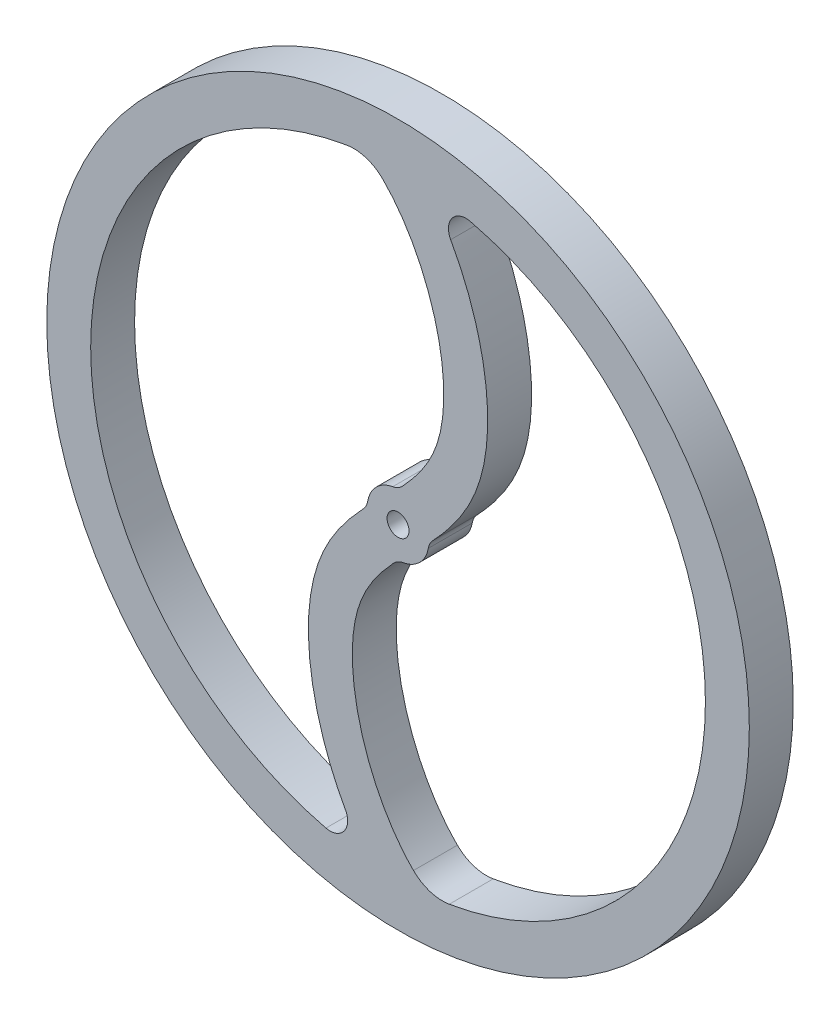
ISO-10303-21;
HEADER;
FILE_DESCRIPTION(('STEP AP214'),'2;1');
FILE_NAME('part.step','',(''),(''),'','','');
FILE_SCHEMA(('AUTOMOTIVE_DESIGN { 1 0 10303 214 1 1 1 1 }'));
ENDSEC;
DATA;
#1=APPLICATION_CONTEXT('core data for automotive mechanical design processes');
#2=APPLICATION_PROTOCOL_DEFINITION('international standard','automotive_design',2000,#1);
#3=PRODUCT_CONTEXT('',#1,'mechanical');
#4=PRODUCT('Part','Part','',(#3));
#5=PRODUCT_RELATED_PRODUCT_CATEGORY('part','',(#4));
#6=PRODUCT_DEFINITION_FORMATION('','',#4);
#7=PRODUCT_DEFINITION_CONTEXT('part definition',#1,'design');
#8=PRODUCT_DEFINITION('design','',#6,#7);
#9=PRODUCT_DEFINITION_SHAPE('','',#8);
#10=(LENGTH_UNIT() NAMED_UNIT(*) SI_UNIT(.MILLI.,.METRE.));
#11=(NAMED_UNIT(*) PLANE_ANGLE_UNIT() SI_UNIT($,.RADIAN.));
#12=(NAMED_UNIT(*) SI_UNIT($,.STERADIAN.) SOLID_ANGLE_UNIT());
#13=UNCERTAINTY_MEASURE_WITH_UNIT(LENGTH_MEASURE(1.E-05),#10,'distance_accuracy_value','');
#14=(GEOMETRIC_REPRESENTATION_CONTEXT(3) GLOBAL_UNCERTAINTY_ASSIGNED_CONTEXT((#13)) GLOBAL_UNIT_ASSIGNED_CONTEXT((#10,
#11,#12)) REPRESENTATION_CONTEXT('',''));
#15=CARTESIAN_POINT('',(0.,0.,0.));
#16=DIRECTION('',(0.,0.,1.));
#17=DIRECTION('',(1.,0.,0.));
#18=AXIS2_PLACEMENT_3D('',#15,#16,#17);
#19=CARTESIAN_POINT('',(0.,0.,50.));
#20=DIRECTION('',(0.,0.,-1.));
#21=DIRECTION('',(-1.,0.,0.));
#22=AXIS2_PLACEMENT_3D('',#19,#20,#21);
#23=CYLINDRICAL_SURFACE('',#22,350.);
#24=CARTESIAN_POINT('',(0.,0.,50.));
#25=DIRECTION('',(0.,0.,1.));
#26=DIRECTION('',(1.,0.,0.));
#27=AXIS2_PLACEMENT_3D('',#24,#25,#26);
#28=CIRCLE('',#27,350.);
#29=CARTESIAN_POINT('',(-58.3272137263762,345.105688360707,50.));
#30=VERTEX_POINT('',#29);
#31=CARTESIAN_POINT('',(-82.084704990665,-340.238300616782,50.));
#32=VERTEX_POINT('',#31);
#33=EDGE_CURVE('E298',#30,#32,#28,.T.);
#34=ORIENTED_EDGE('',*,*,#33,.T.);
#35=DIRECTION('',(0.,0.,-1.));
#36=VECTOR('',#35,1.);
#37=CARTESIAN_POINT('',(-82.084704990665,-340.238300616782,50.));
#38=LINE('',#37,#36);
#39=CARTESIAN_POINT('',(-82.084704990665,-340.238300616782,0.));
#40=VERTEX_POINT('',#39);
#41=EDGE_CURVE('E54',#32,#40,#38,.T.);
#42=ORIENTED_EDGE('',*,*,#41,.T.);
#43=CARTESIAN_POINT('',(0.,0.,0.));
#44=DIRECTION('',(0.,0.,1.));
#45=DIRECTION('',(1.,0.,0.));
#46=AXIS2_PLACEMENT_3D('',#43,#44,#45);
#47=CIRCLE('',#46,350.);
#48=CARTESIAN_POINT('',(-58.3272137263762,345.105688360707,0.));
#49=VERTEX_POINT('',#48);
#50=EDGE_CURVE('E303',#49,#40,#47,.T.);
#51=ORIENTED_EDGE('',*,*,#50,.F.);
#52=DIRECTION('',(0.,0.,1.));
#53=VECTOR('',#52,1.);
#54=CARTESIAN_POINT('',(-58.3272137263762,345.105688360707,0.));
#55=LINE('',#54,#53);
#56=EDGE_CURVE('E179',#49,#30,#55,.T.);
#57=ORIENTED_EDGE('',*,*,#56,.T.);
#58=EDGE_LOOP('',(#34,#42,#51,#57));
#59=FACE_BOUND('',#58,.T.);
#60=ADVANCED_FACE('F33',(#59),#23,.F.);
#61=CARTESIAN_POINT('',(58.3272137263758,-345.105688360707,50.));
#62=VERTEX_POINT('',#61);
#63=CARTESIAN_POINT('',(82.0847049906647,340.238300616782,50.));
#64=VERTEX_POINT('',#63);
#65=EDGE_CURVE('E304',#62,#64,#28,.T.);
#66=ORIENTED_EDGE('',*,*,#65,.T.);
#67=DIRECTION('',(0.,0.,-1.));
#68=VECTOR('',#67,1.);
#69=CARTESIAN_POINT('',(82.0847049906647,340.238300616782,50.));
#70=LINE('',#69,#68);
#71=CARTESIAN_POINT('',(82.0847049906647,340.238300616782,0.));
#72=VERTEX_POINT('',#71);
#73=EDGE_CURVE('E246',#64,#72,#70,.T.);
#74=ORIENTED_EDGE('',*,*,#73,.T.);
#75=CARTESIAN_POINT('',(58.3272137263758,-345.105688360707,0.));
#76=VERTEX_POINT('',#75);
#77=EDGE_CURVE('E301',#76,#72,#47,.T.);
#78=ORIENTED_EDGE('',*,*,#77,.F.);
#79=DIRECTION('',(0.,0.,1.));
#80=VECTOR('',#79,1.);
#81=CARTESIAN_POINT('',(58.3272137263759,-345.105688360707,0.));
#82=LINE('',#81,#80);
#83=EDGE_CURVE('E174',#76,#62,#82,.T.);
#84=ORIENTED_EDGE('',*,*,#83,.T.);
#85=EDGE_LOOP('',(#66,#74,#78,#84));
#86=FACE_BOUND('',#85,.T.);
#87=ADVANCED_FACE('F207',(#86),#23,.F.);
#88=CARTESIAN_POINT('',(0.,0.,50.));
#89=DIRECTION('',(0.,0.,1.));
#90=DIRECTION('',(1.,0.,0.));
#91=AXIS2_PLACEMENT_3D('',#88,#89,#90);
#92=PLANE('',#91);
#93=CARTESIAN_POINT('',(17.149342574829,-18.1906582962563,50.));
#94=CARTESIAN_POINT('',(10.0019730732707,-24.9288799754758,50.));
#95=CARTESIAN_POINT('',(3.50754817185446,-31.3495708959232,50.));
#96=CARTESIAN_POINT('',(-8.21764362356505,-43.7156824544816,50.));
#97=CARTESIAN_POINT('',(-13.4475780469568,-49.6601585870275,50.));
#98=CARTESIAN_POINT('',(-22.7254305235677,-61.2369274260487,50.));
#99=CARTESIAN_POINT('',(-26.7733549149248,-66.8673956424509,50.));
#100=CARTESIAN_POINT('',(-33.8269963481467,-78.0251737275643,50.));
#101=CARTESIAN_POINT('',(-36.8348788546674,-83.5515578107266,50.));
#102=CARTESIAN_POINT('',(-41.9774524840394,-94.8067660845439,50.));
#103=CARTESIAN_POINT('',(-44.1147424738928,-100.538037841318,50.));
#104=CARTESIAN_POINT('',(-46.7525825776662,-109.576215007821,50.));
#105=CARTESIAN_POINT('',(-47.5396838481792,-112.675350651119,50.));
#106=CARTESIAN_POINT('',(-48.9283342206348,-119.037172715313,50.));
#107=CARTESIAN_POINT('',(-49.5295652477318,-122.298741473664,50.));
#108=CARTESIAN_POINT('',(-51.0512059884212,-132.298518999284,50.));
#109=CARTESIAN_POINT('',(-51.6888935200213,-139.252087770985,50.));
#110=CARTESIAN_POINT('',(-52.2123802502918,-153.576755976027,50.));
#111=CARTESIAN_POINT('',(-52.098340215919,-160.947531131792,50.));
#112=CARTESIAN_POINT('',(-51.1392686605426,-175.943459389696,50.));
#113=CARTESIAN_POINT('',(-50.2943927842755,-183.568496033635,50.));
#114=CARTESIAN_POINT('',(-47.9085780760293,-198.910612564675,50.));
#115=CARTESIAN_POINT('',(-46.3677385164282,-206.627670241358,50.));
#116=CARTESIAN_POINT('',(-40.7686365120507,-229.677168598241,50.));
#117=CARTESIAN_POINT('',(-35.7301634412691,-244.906938456075,50.));
#118=CARTESIAN_POINT('',(-26.5539725924694,-266.60880940103,50.));
#119=CARTESIAN_POINT('',(-23.2263928860285,-273.652542218094,50.));
#120=CARTESIAN_POINT('',(-16.1026177049819,-287.206307092286,50.));
#121=CARTESIAN_POINT('',(-12.3063250820889,-293.716264205117,50.));
#122=CARTESIAN_POINT('',(-4.32490232859608,-306.052383762718,50.));
#123=CARTESIAN_POINT('',(-0.139661855247525,-311.878345733144,50.));
#124=CARTESIAN_POINT('',(8.52579910442872,-322.703406144645,50.));
#125=CARTESIAN_POINT('',(13.0060293971363,-327.702076571044,50.));
#126=CARTESIAN_POINT('',(17.578582701685,-332.223795956391,50.));
#127=B_SPLINE_CURVE_WITH_KNOTS('',3,(#93,#94,#95,#96,#97,#98,#99,#100,#101,#102,#103,#104,#105,
#106,#107,#108,#109,#110,#111,#112,#113,#114,#115,#116,#117,#118,#119,#120,#121,#122,#123,#124,
#125,#126),.UNSPECIFIED.,.F.,.F.,(4,2,2,2,2,2,2,2,2,2,2,2,2,2,2,2,4),(0.,0.0624999999999998,
0.125,0.1875,0.249999999999999,0.312499999999999,0.343749999999999,0.374999999999999,
0.437499999999999,0.5,0.5625,0.625,0.75,0.8125,0.875,0.9375,1.),.UNSPECIFIED.);
#128=CARTESIAN_POINT('',(-5.22383278327359,-40.5938713471879,50.));
#129=VERTEX_POINT('',#128);
#130=CARTESIAN_POINT('',(17.578582701685,-332.223795956391,50.));
#131=VERTEX_POINT('',#130);
#132=EDGE_CURVE('E165',#129,#131,#127,.T.);
#133=ORIENTED_EDGE('',*,*,#132,.F.);
#134=CARTESIAN_POINT('',(9.45159659294896,-54.1817988059104,50.));
#135=DIRECTION('',(0.,0.,1.));
#136=DIRECTION('',(1.,0.,0.));
#137=AXIS2_PLACEMENT_3D('',#134,#135,#136);
#138=CIRCLE('',#137,20.);
#139=CARTESIAN_POINT('',(6.01465237733116,-34.4793265128521,50.));
#140=VERTEX_POINT('',#139);
#141=EDGE_CURVE('E263',#129,#140,#138,.F.);
#142=ORIENTED_EDGE('',*,*,#141,.T.);
#143=CARTESIAN_POINT('',(0.,0.,50.));
#144=DIRECTION('',(0.,0.,1.));
#145=DIRECTION('',(1.,0.,0.));
#146=AXIS2_PLACEMENT_3D('',#143,#144,#145);
#147=CIRCLE('',#146,35.);
#148=CARTESIAN_POINT('',(34.4671247851543,-6.08418515863889,50.));
#149=VERTEX_POINT('',#148);
#150=EDGE_CURVE('E374',#140,#149,#147,.T.);
#151=ORIENTED_EDGE('',*,*,#150,.T.);
#152=CARTESIAN_POINT('',(54.1626246623853,-9.56086239214683,50.));
#153=DIRECTION('',(0.,0.,1.));
#154=DIRECTION('',(1.,0.,0.));
#155=AXIS2_PLACEMENT_3D('',#152,#153,#154);
#156=CIRCLE('',#155,20.);
#157=CARTESIAN_POINT('',(39.6030909664774,4.15117533233899,50.));
#158=VERTEX_POINT('',#157);
#159=EDGE_CURVE('E265',#149,#158,#156,.F.);
#160=ORIENTED_EDGE('',*,*,#159,.T.);
#161=CARTESIAN_POINT('',(17.578582701685,367.776204043609,50.));
#162=CARTESIAN_POINT('',(23.6359081424478,361.786219007982,50.));
#163=CARTESIAN_POINT('',(29.3883478337587,355.34889743074,50.));
#164=CARTESIAN_POINT('',(40.2933509455273,341.726157910959,50.));
#165=CARTESIAN_POINT('',(45.445904559605,334.540311953744,50.));
#166=CARTESIAN_POINT('',(55.1447357103657,319.549758973399,50.));
#167=CARTESIAN_POINT('',(59.6909029043,311.744851475925,50.));
#168=CARTESIAN_POINT('',(68.1562547123025,295.638589688179,50.));
#169=CARTESIAN_POINT('',(72.0753421780833,287.337160453609,50.));
#170=CARTESIAN_POINT('',(82.8447763180303,261.867237943672,50.));
#171=CARTESIAN_POINT('',(88.7108845358555,244.134069098258,50.));
#172=CARTESIAN_POINT('',(95.2771511645116,217.1031002483,50.));
#173=CARTESIAN_POINT('',(97.0928505992756,208.020658997374,50.));
#174=CARTESIAN_POINT('',(99.9224877391274,189.82451719721,50.));
#175=CARTESIAN_POINT('',(100.936524716593,180.710794437552,50.));
#176=CARTESIAN_POINT('',(102.097194354044,162.562702653611,50.));
#177=CARTESIAN_POINT('',(102.243982658765,153.528217171128,50.));
#178=CARTESIAN_POINT('',(101.590583178579,135.648622106355,50.));
#179=CARTESIAN_POINT('',(100.790556160628,126.80318824649,50.));
#180=CARTESIAN_POINT('',(98.806374130001,113.763724760775,50.));
#181=CARTESIAN_POINT('',(98.0141224088278,109.45542367135,50.));
#182=CARTESIAN_POINT('',(96.1534996723292,100.931355257163,50.));
#183=CARTESIAN_POINT('',(95.0848096919694,96.7145404126539,50.));
#184=CARTESIAN_POINT('',(91.4429841344797,84.2363524622155,50.));
#185=CARTESIAN_POINT('',(88.4441912422538,76.1921214880771,50.));
#186=CARTESIAN_POINT('',(81.3237276008254,60.6080371236484,50.));
#187=CARTESIAN_POINT('',(77.2046557186251,53.0706312994771,50.));
#188=CARTESIAN_POINT('',(67.9219235769289,38.386773856317,50.));
#189=CARTESIAN_POINT('',(62.7604287820891,31.2393964517795,50.));
#190=CARTESIAN_POINT('',(51.4453847979965,17.1206497981305,50.));
#191=CARTESIAN_POINT('',(45.2918419468816,10.147456058946,50.));
#192=CARTESIAN_POINT('',(31.984427814144,-3.88736491393176,50.));
#193=CARTESIAN_POINT('',(24.8297240619099,-10.9499366531901,50.));
#194=CARTESIAN_POINT('',(17.149342574829,-18.1906582962563,50.));
#195=B_SPLINE_CURVE_WITH_KNOTS('',3,(#161,#162,#163,#164,#165,#166,#167,#168,#169,#170,#171,
#172,#173,#174,#175,#176,#177,#178,#179,#180,#181,#182,#183,#184,#185,#186,#187,#188,#189,#190,
#191,#192,#193,#194),.UNSPECIFIED.,.F.,.F.,(4,2,2,2,2,2,2,2,2,2,2,2,2,2,2,2,4),(0.,0.0625,0.125,
0.1875,0.25,0.375,0.4375,0.5,0.5625,0.625,0.65625,0.6875,0.75,0.8125,0.875,0.9375,1.),.UNSPECIFIED.);
#196=CARTESIAN_POINT('',(59.9462766557759,311.020034007364,50.));
#197=VERTEX_POINT('',#196);
#198=EDGE_CURVE('E312',#197,#158,#195,.T.);
#199=ORIENTED_EDGE('',*,*,#198,.F.);
#200=CARTESIAN_POINT('',(77.3941504197696,320.796112010109,50.));
#201=DIRECTION('',(0.,0.,1.));
#202=DIRECTION('',(1.,0.,0.));
#203=AXIS2_PLACEMENT_3D('',#200,#201,#202);
#204=CIRCLE('',#203,20.);
#205=EDGE_CURVE('E243',#197,#64,#204,.F.);
#206=ORIENTED_EDGE('',*,*,#205,.T.);
#207=ORIENTED_EDGE('',*,*,#65,.F.);
#208=CARTESIAN_POINT('',(50.5199193338469,-298.912127354895,50.));
#209=DIRECTION('',(0.,0.,-1.));
#210=DIRECTION('',(1.,0.,0.));
#211=AXIS2_PLACEMENT_3D('',#208,#209,#210);
#212=CIRCLE('',#211,46.8486811354313);
#213=EDGE_CURVE('E175',#62,#131,#212,.T.);
#214=ORIENTED_EDGE('',*,*,#213,.T.);
#215=EDGE_LOOP('',(#133,#142,#151,#160,#199,#206,#207,#214));
#216=FACE_BOUND('',#215,.T.);
#217=CARTESIAN_POINT('',(-17.5785827016851,332.223795956391,50.));
#218=CARTESIAN_POINT('',(-13.0060293971365,327.702076571044,50.));
#219=CARTESIAN_POINT('',(-8.52579910442891,322.703406144645,50.));
#220=CARTESIAN_POINT('',(0.139661855247329,311.878345733144,50.));
#221=CARTESIAN_POINT('',(4.32490232859586,306.052383762718,50.));
#222=CARTESIAN_POINT('',(12.3063250820887,293.716264205117,50.));
#223=CARTESIAN_POINT('',(16.1026177049817,287.206307092286,50.));
#224=CARTESIAN_POINT('',(23.2263928860283,273.652542218094,50.));
#225=CARTESIAN_POINT('',(26.5539725924692,266.60880940103,50.));
#226=CARTESIAN_POINT('',(35.730163441269,244.906938456075,50.));
#227=CARTESIAN_POINT('',(40.7686365120505,229.677168598241,50.));
#228=CARTESIAN_POINT('',(46.3677385164281,206.627670241358,50.));
#229=CARTESIAN_POINT('',(47.9085780760292,198.910612564675,50.));
#230=CARTESIAN_POINT('',(50.2943927842754,183.568496033635,50.));
#231=CARTESIAN_POINT('',(51.1392686605425,175.943459389696,50.));
#232=CARTESIAN_POINT('',(52.0983402159189,160.947531131792,50.));
#233=CARTESIAN_POINT('',(52.2123802502918,153.576755976027,50.));
#234=CARTESIAN_POINT('',(51.6888935200212,139.252087770985,50.));
#235=CARTESIAN_POINT('',(51.0512059884212,132.298518999284,50.));
#236=CARTESIAN_POINT('',(49.5295652477318,122.298741473664,50.));
#237=CARTESIAN_POINT('',(48.9283342206348,119.037172715313,50.));
#238=CARTESIAN_POINT('',(47.5396838481792,112.675350651119,50.));
#239=CARTESIAN_POINT('',(46.7525825776661,109.576215007821,50.));
#240=CARTESIAN_POINT('',(44.1147424738928,100.538037841318,50.));
#241=CARTESIAN_POINT('',(41.9774524840394,94.8067660845439,50.));
#242=CARTESIAN_POINT('',(36.8348788546674,83.5515578107266,50.));
#243=CARTESIAN_POINT('',(33.8269963481467,78.0251737275643,50.));
#244=CARTESIAN_POINT('',(26.7733549149249,66.8673956424509,50.));
#245=CARTESIAN_POINT('',(22.7254305235677,61.2369274260486,50.));
#246=CARTESIAN_POINT('',(13.4475780469568,49.6601585870274,50.));
#247=CARTESIAN_POINT('',(8.21764362356506,43.7156824544816,50.));
#248=CARTESIAN_POINT('',(-3.50754817185448,31.3495708959232,50.));
#249=CARTESIAN_POINT('',(-10.0019730732707,24.9288799754758,50.));
#250=CARTESIAN_POINT('',(-17.149342574829,18.1906582962563,50.));
#251=B_SPLINE_CURVE_WITH_KNOTS('',3,(#217,#218,#219,#220,#221,#222,#223,#224,#225,#226,#227,
#228,#229,#230,#231,#232,#233,#234,#235,#236,#237,#238,#239,#240,#241,#242,#243,#244,#245,#246,
#247,#248,#249,#250),.UNSPECIFIED.,.F.,.F.,(4,2,2,2,2,2,2,2,2,2,2,2,2,2,2,2,4),(0.,
0.0625000000000002,0.125,0.1875,0.250000000000001,0.375,0.4375,0.5,0.5625,0.625000000000001,
0.65625,0.6875,0.75,0.8125,0.875,0.9375,1.),.UNSPECIFIED.);
#252=CARTESIAN_POINT('',(-17.5785827016851,332.223795956391,50.));
#253=VERTEX_POINT('',#252);
#254=CARTESIAN_POINT('',(5.22383278327357,40.5938713471879,50.));
#255=VERTEX_POINT('',#254);
#256=EDGE_CURVE('E188',#253,#255,#251,.T.);
#257=ORIENTED_EDGE('',*,*,#256,.T.);
#258=CARTESIAN_POINT('',(-9.45159659294896,54.1817988059105,50.));
#259=DIRECTION('',(0.,0.,1.));
#260=DIRECTION('',(1.,0.,0.));
#261=AXIS2_PLACEMENT_3D('',#258,#259,#260);
#262=CIRCLE('',#261,20.);
#263=CARTESIAN_POINT('',(-6.01465237733115,34.4793265128521,50.));
#264=VERTEX_POINT('',#263);
#265=EDGE_CURVE('E258',#255,#264,#262,.F.);
#266=ORIENTED_EDGE('',*,*,#265,.T.);
#267=CARTESIAN_POINT('',(-34.4671247851543,6.08418515863889,50.));
#268=VERTEX_POINT('',#267);
#269=EDGE_CURVE('E369',#264,#268,#147,.T.);
#270=ORIENTED_EDGE('',*,*,#269,.T.);
#271=CARTESIAN_POINT('',(-54.1626246623853,9.56086239214683,50.));
#272=DIRECTION('',(0.,0.,1.));
#273=DIRECTION('',(1.,0.,0.));
#274=AXIS2_PLACEMENT_3D('',#271,#272,#273);
#275=CIRCLE('',#274,20.);
#276=CARTESIAN_POINT('',(-39.6030909664774,-4.15117533233899,50.));
#277=VERTEX_POINT('',#276);
#278=EDGE_CURVE('E256',#268,#277,#275,.F.);
#279=ORIENTED_EDGE('',*,*,#278,.T.);
#280=CARTESIAN_POINT('',(-17.149342574829,18.1906582962563,50.));
#281=CARTESIAN_POINT('',(-24.8297240619099,10.9499366531901,50.));
#282=CARTESIAN_POINT('',(-31.9844278141441,3.88736491393175,50.));
#283=CARTESIAN_POINT('',(-45.2918419468816,-10.147456058946,50.));
#284=CARTESIAN_POINT('',(-51.4453847979965,-17.1206497981306,50.));
#285=CARTESIAN_POINT('',(-62.7604287820892,-31.2393964517795,50.));
#286=CARTESIAN_POINT('',(-67.9219235769289,-38.386773856317,50.));
#287=CARTESIAN_POINT('',(-77.2046557186251,-53.0706312994771,50.));
#288=CARTESIAN_POINT('',(-81.3237276008255,-60.6080371236484,50.));
#289=CARTESIAN_POINT('',(-88.4441912422538,-76.1921214880771,50.));
#290=CARTESIAN_POINT('',(-91.4429841344797,-84.2363524622154,50.));
#291=CARTESIAN_POINT('',(-95.0848096919693,-96.7145404126539,50.));
#292=CARTESIAN_POINT('',(-96.1534996723292,-100.931355257163,50.));
#293=CARTESIAN_POINT('',(-98.0141224088278,-109.45542367135,50.));
#294=CARTESIAN_POINT('',(-98.806374130001,-113.763724760775,50.));
#295=CARTESIAN_POINT('',(-100.790556160628,-126.80318824649,50.));
#296=CARTESIAN_POINT('',(-101.590583178579,-135.648622106355,50.));
#297=CARTESIAN_POINT('',(-102.243982658765,-153.528217171127,50.));
#298=CARTESIAN_POINT('',(-102.097194354044,-162.562702653611,50.));
#299=CARTESIAN_POINT('',(-100.936524716593,-180.710794437552,50.));
#300=CARTESIAN_POINT('',(-99.9224877391275,-189.82451719721,50.));
#301=CARTESIAN_POINT('',(-97.0928505992757,-208.020658997374,50.));
#302=CARTESIAN_POINT('',(-95.2771511645117,-217.1031002483,50.));
#303=CARTESIAN_POINT('',(-88.7108845358557,-244.134069098258,50.));
#304=CARTESIAN_POINT('',(-82.8447763180305,-261.867237943672,50.));
#305=CARTESIAN_POINT('',(-72.0753421780835,-287.337160453609,50.));
#306=CARTESIAN_POINT('',(-68.1562547123027,-295.638589688179,50.));
#307=CARTESIAN_POINT('',(-59.6909029043002,-311.744851475925,50.));
#308=CARTESIAN_POINT('',(-55.1447357103659,-319.549758973399,50.));
#309=CARTESIAN_POINT('',(-45.4459045596052,-334.540311953744,50.));
#310=CARTESIAN_POINT('',(-40.2933509455275,-341.726157910959,50.));
#311=CARTESIAN_POINT('',(-29.3883478337589,-355.34889743074,50.));
#312=CARTESIAN_POINT('',(-23.6359081424479,-361.786219007982,50.));
#313=CARTESIAN_POINT('',(-17.5785827016851,-367.776204043609,50.));
#314=B_SPLINE_CURVE_WITH_KNOTS('',3,(#280,#281,#282,#283,#284,#285,#286,#287,#288,#289,#290,
#291,#292,#293,#294,#295,#296,#297,#298,#299,#300,#301,#302,#303,#304,#305,#306,#307,#308,#309,
#310,#311,#312,#313),.UNSPECIFIED.,.F.,.F.,(4,2,2,2,2,2,2,2,2,2,2,2,2,2,2,2,4),(0.,
0.0624999999999999,0.125,0.1875,0.25,0.3125,0.34375,0.375,0.4375,0.5,0.5625,0.625,0.75,0.8125,
0.875,0.9375,1.),.UNSPECIFIED.);
#315=CARTESIAN_POINT('',(-59.9462766557762,-311.020034007364,50.));
#316=VERTEX_POINT('',#315);
#317=EDGE_CURVE('E177',#277,#316,#314,.T.);
#318=ORIENTED_EDGE('',*,*,#317,.T.);
#319=CARTESIAN_POINT('',(-77.3941504197698,-320.796112010109,50.));
#320=DIRECTION('',(0.,0.,1.));
#321=DIRECTION('',(1.,0.,0.));
#322=AXIS2_PLACEMENT_3D('',#319,#320,#321);
#323=CIRCLE('',#322,20.);
#324=EDGE_CURVE('E41',#316,#32,#323,.F.);
#325=ORIENTED_EDGE('',*,*,#324,.T.);
#326=ORIENTED_EDGE('',*,*,#33,.F.);
#327=CARTESIAN_POINT('',(-50.5199193338472,298.912127354895,50.));
#328=DIRECTION('',(0.,0.,-1.));
#329=DIRECTION('',(1.,0.,0.));
#330=AXIS2_PLACEMENT_3D('',#327,#328,#329);
#331=CIRCLE('',#330,46.8486811354314);
#332=EDGE_CURVE('E382',#30,#253,#331,.T.);
#333=ORIENTED_EDGE('',*,*,#332,.T.);
#334=EDGE_LOOP('',(#257,#266,#270,#279,#318,#325,#326,#333));
#335=FACE_BOUND('',#334,.T.);
#336=CARTESIAN_POINT('',(0.,0.,50.));
#337=DIRECTION('',(0.,0.,1.));
#338=DIRECTION('',(1.,0.,0.));
#339=AXIS2_PLACEMENT_3D('',#336,#337,#338);
#340=CIRCLE('',#339,400.);
#341=CARTESIAN_POINT('',(400.,0.,50.));
#342=VERTEX_POINT('',#341);
#343=EDGE_CURVE('E294',#342,#342,#340,.T.);
#344=ORIENTED_EDGE('',*,*,#343,.T.);
#345=EDGE_LOOP('',(#344));
#346=FACE_BOUND('',#345,.T.);
#347=CARTESIAN_POINT('',(0.,0.,50.));
#348=DIRECTION('',(0.,0.,1.));
#349=DIRECTION('',(1.,0.,0.));
#350=AXIS2_PLACEMENT_3D('',#347,#348,#349);
#351=CIRCLE('',#350,12.5);
#352=CARTESIAN_POINT('',(12.5,0.,50.));
#353=VERTEX_POINT('',#352);
#354=EDGE_CURVE('E379',#353,#353,#351,.T.);
#355=ORIENTED_EDGE('',*,*,#354,.F.);
#356=EDGE_LOOP('',(#355));
#357=FACE_BOUND('',#356,.T.);
#358=ADVANCED_FACE('F208',(#216,#335,#346,#357),#92,.T.);
#359=CARTESIAN_POINT('',(0.,0.,0.));
#360=DIRECTION('',(0.,0.,1.));
#361=DIRECTION('',(1.,0.,0.));
#362=AXIS2_PLACEMENT_3D('',#359,#360,#361);
#363=PLANE('',#362);
#364=CARTESIAN_POINT('',(0.,0.,0.));
#365=DIRECTION('',(0.,0.,1.));
#366=DIRECTION('',(1.,0.,0.));
#367=AXIS2_PLACEMENT_3D('',#364,#365,#366);
#368=CIRCLE('',#367,35.);
#369=CARTESIAN_POINT('',(6.01465237733116,-34.4793265128521,0.));
#370=VERTEX_POINT('',#369);
#371=CARTESIAN_POINT('',(34.4671247851543,-6.08418515863889,0.));
#372=VERTEX_POINT('',#371);
#373=EDGE_CURVE('E362',#370,#372,#368,.T.);
#374=ORIENTED_EDGE('',*,*,#373,.F.);
#375=CARTESIAN_POINT('',(9.45159659294896,-54.1817988059104,0.));
#376=DIRECTION('',(0.,0.,1.));
#377=DIRECTION('',(1.,0.,0.));
#378=AXIS2_PLACEMENT_3D('',#375,#376,#377);
#379=CIRCLE('',#378,20.);
#380=CARTESIAN_POINT('',(-5.22383278327359,-40.5938713471879,0.));
#381=VERTEX_POINT('',#380);
#382=EDGE_CURVE('E154',#370,#381,#379,.T.);
#383=ORIENTED_EDGE('',*,*,#382,.T.);
#384=CARTESIAN_POINT('',(17.149342574829,-18.1906582962563,0.));
#385=CARTESIAN_POINT('',(10.0019730732707,-24.9288799754758,0.));
#386=CARTESIAN_POINT('',(3.50754817185446,-31.3495708959232,0.));
#387=CARTESIAN_POINT('',(-8.21764362356505,-43.7156824544816,0.));
#388=CARTESIAN_POINT('',(-13.4475780469568,-49.6601585870275,0.));
#389=CARTESIAN_POINT('',(-22.7254305235677,-61.2369274260487,0.));
#390=CARTESIAN_POINT('',(-26.7733549149248,-66.8673956424509,0.));
#391=CARTESIAN_POINT('',(-33.8269963481467,-78.0251737275643,0.));
#392=CARTESIAN_POINT('',(-36.8348788546674,-83.5515578107266,0.));
#393=CARTESIAN_POINT('',(-41.9774524840394,-94.8067660845439,0.));
#394=CARTESIAN_POINT('',(-44.1147424738928,-100.538037841318,0.));
#395=CARTESIAN_POINT('',(-46.7525825776662,-109.576215007821,0.));
#396=CARTESIAN_POINT('',(-47.5396838481792,-112.675350651119,0.));
#397=CARTESIAN_POINT('',(-48.9283342206348,-119.037172715313,0.));
#398=CARTESIAN_POINT('',(-49.5295652477318,-122.298741473664,0.));
#399=CARTESIAN_POINT('',(-51.0512059884212,-132.298518999284,0.));
#400=CARTESIAN_POINT('',(-51.6888935200213,-139.252087770985,0.));
#401=CARTESIAN_POINT('',(-52.2123802502918,-153.576755976027,0.));
#402=CARTESIAN_POINT('',(-52.098340215919,-160.947531131792,0.));
#403=CARTESIAN_POINT('',(-51.1392686605426,-175.943459389696,0.));
#404=CARTESIAN_POINT('',(-50.2943927842755,-183.568496033635,0.));
#405=CARTESIAN_POINT('',(-47.9085780760293,-198.910612564675,0.));
#406=CARTESIAN_POINT('',(-46.3677385164282,-206.627670241358,0.));
#407=CARTESIAN_POINT('',(-40.7686365120507,-229.677168598241,0.));
#408=CARTESIAN_POINT('',(-35.7301634412691,-244.906938456075,0.));
#409=CARTESIAN_POINT('',(-26.5539725924694,-266.60880940103,0.));
#410=CARTESIAN_POINT('',(-23.2263928860285,-273.652542218094,0.));
#411=CARTESIAN_POINT('',(-16.1026177049819,-287.206307092286,0.));
#412=CARTESIAN_POINT('',(-12.3063250820889,-293.716264205117,0.));
#413=CARTESIAN_POINT('',(-4.32490232859608,-306.052383762718,0.));
#414=CARTESIAN_POINT('',(-0.139661855247525,-311.878345733144,0.));
#415=CARTESIAN_POINT('',(8.52579910442872,-322.703406144645,0.));
#416=CARTESIAN_POINT('',(13.0060293971363,-327.702076571044,0.));
#417=CARTESIAN_POINT('',(17.578582701685,-332.223795956391,0.));
#418=B_SPLINE_CURVE_WITH_KNOTS('',3,(#384,#385,#386,#387,#388,#389,#390,#391,#392,#393,#394,
#395,#396,#397,#398,#399,#400,#401,#402,#403,#404,#405,#406,#407,#408,#409,#410,#411,#412,#413,
#414,#415,#416,#417),.UNSPECIFIED.,.F.,.F.,(4,2,2,2,2,2,2,2,2,2,2,2,2,2,2,2,4),(0.,
0.0624999999999998,0.125,0.1875,0.249999999999999,0.312499999999999,0.343749999999999,
0.374999999999999,0.437499999999999,0.5,0.5625,0.625,0.75,0.8125,0.875,0.9375,1.),.UNSPECIFIED.);
#419=CARTESIAN_POINT('',(17.578582701685,-332.223795956391,0.));
#420=VERTEX_POINT('',#419);
#421=EDGE_CURVE('E145',#381,#420,#418,.T.);
#422=ORIENTED_EDGE('',*,*,#421,.T.);
#423=CARTESIAN_POINT('',(50.5199193338469,-298.912127354895,0.));
#424=DIRECTION('',(0.,0.,-1.));
#425=DIRECTION('',(1.,0.,0.));
#426=AXIS2_PLACEMENT_3D('',#423,#424,#425);
#427=CIRCLE('',#426,46.8486811354313);
#428=EDGE_CURVE('E152',#76,#420,#427,.T.);
#429=ORIENTED_EDGE('',*,*,#428,.F.);
#430=ORIENTED_EDGE('',*,*,#77,.T.);
#431=CARTESIAN_POINT('',(77.3941504197696,320.796112010109,0.));
#432=DIRECTION('',(0.,0.,1.));
#433=DIRECTION('',(1.,0.,0.));
#434=AXIS2_PLACEMENT_3D('',#431,#432,#433);
#435=CIRCLE('',#434,20.);
#436=CARTESIAN_POINT('',(59.9462766557759,311.020034007364,0.));
#437=VERTEX_POINT('',#436);
#438=EDGE_CURVE('E250',#72,#437,#435,.T.);
#439=ORIENTED_EDGE('',*,*,#438,.T.);
#440=CARTESIAN_POINT('',(17.578582701685,367.776204043609,0.));
#441=CARTESIAN_POINT('',(23.6359081424478,361.786219007982,0.));
#442=CARTESIAN_POINT('',(29.3883478337587,355.34889743074,0.));
#443=CARTESIAN_POINT('',(40.2933509455273,341.726157910959,0.));
#444=CARTESIAN_POINT('',(45.445904559605,334.540311953744,0.));
#445=CARTESIAN_POINT('',(55.1447357103657,319.549758973399,0.));
#446=CARTESIAN_POINT('',(59.6909029043,311.744851475925,0.));
#447=CARTESIAN_POINT('',(68.1562547123025,295.638589688179,0.));
#448=CARTESIAN_POINT('',(72.0753421780833,287.337160453609,0.));
#449=CARTESIAN_POINT('',(82.8447763180303,261.867237943672,0.));
#450=CARTESIAN_POINT('',(88.7108845358555,244.134069098258,0.));
#451=CARTESIAN_POINT('',(95.2771511645116,217.1031002483,0.));
#452=CARTESIAN_POINT('',(97.0928505992756,208.020658997374,0.));
#453=CARTESIAN_POINT('',(99.9224877391274,189.82451719721,0.));
#454=CARTESIAN_POINT('',(100.936524716593,180.710794437552,0.));
#455=CARTESIAN_POINT('',(102.097194354044,162.562702653611,0.));
#456=CARTESIAN_POINT('',(102.243982658765,153.528217171128,0.));
#457=CARTESIAN_POINT('',(101.590583178579,135.648622106355,0.));
#458=CARTESIAN_POINT('',(100.790556160628,126.80318824649,0.));
#459=CARTESIAN_POINT('',(98.806374130001,113.763724760775,0.));
#460=CARTESIAN_POINT('',(98.0141224088278,109.45542367135,0.));
#461=CARTESIAN_POINT('',(96.1534996723292,100.931355257163,0.));
#462=CARTESIAN_POINT('',(95.0848096919694,96.7145404126539,0.));
#463=CARTESIAN_POINT('',(91.4429841344797,84.2363524622155,0.));
#464=CARTESIAN_POINT('',(88.4441912422538,76.1921214880771,0.));
#465=CARTESIAN_POINT('',(81.3237276008254,60.6080371236484,0.));
#466=CARTESIAN_POINT('',(77.2046557186251,53.0706312994771,0.));
#467=CARTESIAN_POINT('',(67.9219235769289,38.386773856317,0.));
#468=CARTESIAN_POINT('',(62.7604287820891,31.2393964517795,0.));
#469=CARTESIAN_POINT('',(51.4453847979965,17.1206497981305,0.));
#470=CARTESIAN_POINT('',(45.2918419468816,10.147456058946,0.));
#471=CARTESIAN_POINT('',(31.984427814144,-3.88736491393176,0.));
#472=CARTESIAN_POINT('',(24.8297240619099,-10.9499366531901,0.));
#473=CARTESIAN_POINT('',(17.149342574829,-18.1906582962563,0.));
#474=B_SPLINE_CURVE_WITH_KNOTS('',3,(#440,#441,#442,#443,#444,#445,#446,#447,#448,#449,#450,
#451,#452,#453,#454,#455,#456,#457,#458,#459,#460,#461,#462,#463,#464,#465,#466,#467,#468,#469,
#470,#471,#472,#473),.UNSPECIFIED.,.F.,.F.,(4,2,2,2,2,2,2,2,2,2,2,2,2,2,2,2,4),(0.,0.0625,0.125,
0.1875,0.25,0.375,0.4375,0.5,0.5625,0.625,0.65625,0.6875,0.75,0.8125,0.875,0.9375,1.),.UNSPECIFIED.);
#475=CARTESIAN_POINT('',(39.6030909664774,4.15117533233899,0.));
#476=VERTEX_POINT('',#475);
#477=EDGE_CURVE('E158',#437,#476,#474,.T.);
#478=ORIENTED_EDGE('',*,*,#477,.T.);
#479=CARTESIAN_POINT('',(54.1626246623853,-9.56086239214683,0.));
#480=DIRECTION('',(0.,0.,1.));
#481=DIRECTION('',(1.,0.,0.));
#482=AXIS2_PLACEMENT_3D('',#479,#480,#481);
#483=CIRCLE('',#482,20.);
#484=EDGE_CURVE('E267',#476,#372,#483,.T.);
#485=ORIENTED_EDGE('',*,*,#484,.T.);
#486=EDGE_LOOP('',(#374,#383,#422,#429,#430,#439,#478,#485));
#487=FACE_BOUND('',#486,.T.);
#488=CARTESIAN_POINT('',(-17.149342574829,18.1906582962563,0.));
#489=CARTESIAN_POINT('',(-24.8297240619099,10.9499366531901,0.));
#490=CARTESIAN_POINT('',(-31.9844278141441,3.88736491393175,0.));
#491=CARTESIAN_POINT('',(-45.2918419468816,-10.147456058946,0.));
#492=CARTESIAN_POINT('',(-51.4453847979965,-17.1206497981306,0.));
#493=CARTESIAN_POINT('',(-62.7604287820892,-31.2393964517795,0.));
#494=CARTESIAN_POINT('',(-67.9219235769289,-38.386773856317,0.));
#495=CARTESIAN_POINT('',(-77.2046557186251,-53.0706312994771,0.));
#496=CARTESIAN_POINT('',(-81.3237276008255,-60.6080371236484,0.));
#497=CARTESIAN_POINT('',(-88.4441912422538,-76.1921214880771,0.));
#498=CARTESIAN_POINT('',(-91.4429841344797,-84.2363524622154,0.));
#499=CARTESIAN_POINT('',(-95.0848096919693,-96.7145404126539,0.));
#500=CARTESIAN_POINT('',(-96.1534996723292,-100.931355257163,0.));
#501=CARTESIAN_POINT('',(-98.0141224088278,-109.45542367135,0.));
#502=CARTESIAN_POINT('',(-98.806374130001,-113.763724760775,0.));
#503=CARTESIAN_POINT('',(-100.790556160628,-126.80318824649,0.));
#504=CARTESIAN_POINT('',(-101.590583178579,-135.648622106355,0.));
#505=CARTESIAN_POINT('',(-102.243982658765,-153.528217171127,0.));
#506=CARTESIAN_POINT('',(-102.097194354044,-162.562702653611,0.));
#507=CARTESIAN_POINT('',(-100.936524716593,-180.710794437552,0.));
#508=CARTESIAN_POINT('',(-99.9224877391275,-189.82451719721,0.));
#509=CARTESIAN_POINT('',(-97.0928505992757,-208.020658997374,0.));
#510=CARTESIAN_POINT('',(-95.2771511645117,-217.1031002483,0.));
#511=CARTESIAN_POINT('',(-88.7108845358557,-244.134069098258,0.));
#512=CARTESIAN_POINT('',(-82.8447763180305,-261.867237943672,0.));
#513=CARTESIAN_POINT('',(-72.0753421780835,-287.337160453609,0.));
#514=CARTESIAN_POINT('',(-68.1562547123027,-295.638589688179,0.));
#515=CARTESIAN_POINT('',(-59.6909029043002,-311.744851475925,0.));
#516=CARTESIAN_POINT('',(-55.1447357103659,-319.549758973399,0.));
#517=CARTESIAN_POINT('',(-45.4459045596052,-334.540311953744,0.));
#518=CARTESIAN_POINT('',(-40.2933509455275,-341.726157910959,0.));
#519=CARTESIAN_POINT('',(-29.3883478337589,-355.34889743074,0.));
#520=CARTESIAN_POINT('',(-23.6359081424479,-361.786219007982,0.));
#521=CARTESIAN_POINT('',(-17.5785827016851,-367.776204043609,0.));
#522=B_SPLINE_CURVE_WITH_KNOTS('',3,(#488,#489,#490,#491,#492,#493,#494,#495,#496,#497,#498,
#499,#500,#501,#502,#503,#504,#505,#506,#507,#508,#509,#510,#511,#512,#513,#514,#515,#516,#517,
#518,#519,#520,#521),.UNSPECIFIED.,.F.,.F.,(4,2,2,2,2,2,2,2,2,2,2,2,2,2,2,2,4),(0.,
0.0624999999999999,0.125,0.1875,0.25,0.3125,0.34375,0.375,0.4375,0.5,0.5625,0.625,0.75,0.8125,
0.875,0.9375,1.),.UNSPECIFIED.);
#523=CARTESIAN_POINT('',(-39.6030909664774,-4.15117533233899,0.));
#524=VERTEX_POINT('',#523);
#525=CARTESIAN_POINT('',(-59.9462766557762,-311.020034007364,0.));
#526=VERTEX_POINT('',#525);
#527=EDGE_CURVE('E159',#524,#526,#522,.T.);
#528=ORIENTED_EDGE('',*,*,#527,.F.);
#529=CARTESIAN_POINT('',(-54.1626246623853,9.56086239214683,0.));
#530=DIRECTION('',(0.,0.,1.));
#531=DIRECTION('',(1.,0.,0.));
#532=AXIS2_PLACEMENT_3D('',#529,#530,#531);
#533=CIRCLE('',#532,20.);
#534=CARTESIAN_POINT('',(-34.4671247851543,6.08418515863889,0.));
#535=VERTEX_POINT('',#534);
#536=EDGE_CURVE('E252',#524,#535,#533,.T.);
#537=ORIENTED_EDGE('',*,*,#536,.T.);
#538=CARTESIAN_POINT('',(-6.01465237733115,34.4793265128521,0.));
#539=VERTEX_POINT('',#538);
#540=EDGE_CURVE('E368',#539,#535,#368,.T.);
#541=ORIENTED_EDGE('',*,*,#540,.F.);
#542=CARTESIAN_POINT('',(-9.45159659294896,54.1817988059105,0.));
#543=DIRECTION('',(0.,0.,1.));
#544=DIRECTION('',(1.,0.,0.));
#545=AXIS2_PLACEMENT_3D('',#542,#543,#544);
#546=CIRCLE('',#545,20.);
#547=CARTESIAN_POINT('',(5.22383278327357,40.5938713471879,0.));
#548=VERTEX_POINT('',#547);
#549=EDGE_CURVE('E260',#539,#548,#546,.T.);
#550=ORIENTED_EDGE('',*,*,#549,.T.);
#551=CARTESIAN_POINT('',(-17.5785827016851,332.223795956391,0.));
#552=CARTESIAN_POINT('',(-13.0060293971365,327.702076571044,0.));
#553=CARTESIAN_POINT('',(-8.52579910442891,322.703406144645,0.));
#554=CARTESIAN_POINT('',(0.139661855247329,311.878345733144,0.));
#555=CARTESIAN_POINT('',(4.32490232859586,306.052383762718,0.));
#556=CARTESIAN_POINT('',(12.3063250820887,293.716264205117,0.));
#557=CARTESIAN_POINT('',(16.1026177049817,287.206307092286,0.));
#558=CARTESIAN_POINT('',(23.2263928860283,273.652542218094,0.));
#559=CARTESIAN_POINT('',(26.5539725924692,266.60880940103,0.));
#560=CARTESIAN_POINT('',(35.730163441269,244.906938456075,0.));
#561=CARTESIAN_POINT('',(40.7686365120505,229.677168598241,0.));
#562=CARTESIAN_POINT('',(46.3677385164281,206.627670241358,0.));
#563=CARTESIAN_POINT('',(47.9085780760292,198.910612564675,0.));
#564=CARTESIAN_POINT('',(50.2943927842754,183.568496033635,0.));
#565=CARTESIAN_POINT('',(51.1392686605425,175.943459389696,0.));
#566=CARTESIAN_POINT('',(52.0983402159189,160.947531131792,0.));
#567=CARTESIAN_POINT('',(52.2123802502918,153.576755976027,0.));
#568=CARTESIAN_POINT('',(51.6888935200212,139.252087770985,0.));
#569=CARTESIAN_POINT('',(51.0512059884212,132.298518999284,0.));
#570=CARTESIAN_POINT('',(49.5295652477318,122.298741473664,0.));
#571=CARTESIAN_POINT('',(48.9283342206348,119.037172715313,0.));
#572=CARTESIAN_POINT('',(47.5396838481792,112.675350651119,0.));
#573=CARTESIAN_POINT('',(46.7525825776661,109.576215007821,0.));
#574=CARTESIAN_POINT('',(44.1147424738928,100.538037841318,0.));
#575=CARTESIAN_POINT('',(41.9774524840394,94.8067660845439,0.));
#576=CARTESIAN_POINT('',(36.8348788546674,83.5515578107266,0.));
#577=CARTESIAN_POINT('',(33.8269963481467,78.0251737275643,0.));
#578=CARTESIAN_POINT('',(26.7733549149249,66.8673956424509,0.));
#579=CARTESIAN_POINT('',(22.7254305235677,61.2369274260486,0.));
#580=CARTESIAN_POINT('',(13.4475780469568,49.6601585870274,0.));
#581=CARTESIAN_POINT('',(8.21764362356506,43.7156824544816,0.));
#582=CARTESIAN_POINT('',(-3.50754817185448,31.3495708959232,0.));
#583=CARTESIAN_POINT('',(-10.0019730732707,24.9288799754758,0.));
#584=CARTESIAN_POINT('',(-17.149342574829,18.1906582962563,0.));
#585=B_SPLINE_CURVE_WITH_KNOTS('',3,(#551,#552,#553,#554,#555,#556,#557,#558,#559,#560,#561,
#562,#563,#564,#565,#566,#567,#568,#569,#570,#571,#572,#573,#574,#575,#576,#577,#578,#579,#580,
#581,#582,#583,#584),.UNSPECIFIED.,.F.,.F.,(4,2,2,2,2,2,2,2,2,2,2,2,2,2,2,2,4),(0.,
0.0625000000000002,0.125,0.1875,0.250000000000001,0.375,0.4375,0.5,0.5625,0.625000000000001,
0.65625,0.6875,0.75,0.8125,0.875,0.9375,1.),.UNSPECIFIED.);
#586=CARTESIAN_POINT('',(-17.5785827016851,332.223795956391,0.));
#587=VERTEX_POINT('',#586);
#588=EDGE_CURVE('E170',#587,#548,#585,.T.);
#589=ORIENTED_EDGE('',*,*,#588,.F.);
#590=CARTESIAN_POINT('',(-50.5199193338472,298.912127354895,0.));
#591=DIRECTION('',(0.,0.,-1.));
#592=DIRECTION('',(1.,0.,0.));
#593=AXIS2_PLACEMENT_3D('',#590,#591,#592);
#594=CIRCLE('',#593,46.8486811354314);
#595=EDGE_CURVE('E383',#49,#587,#594,.T.);
#596=ORIENTED_EDGE('',*,*,#595,.F.);
#597=ORIENTED_EDGE('',*,*,#50,.T.);
#598=CARTESIAN_POINT('',(-77.3941504197698,-320.796112010109,0.));
#599=DIRECTION('',(0.,0.,1.));
#600=DIRECTION('',(1.,0.,0.));
#601=AXIS2_PLACEMENT_3D('',#598,#599,#600);
#602=CIRCLE('',#601,20.);
#603=EDGE_CURVE('E11',#40,#526,#602,.T.);
#604=ORIENTED_EDGE('',*,*,#603,.T.);
#605=EDGE_LOOP('',(#528,#537,#541,#550,#589,#596,#597,#604));
#606=FACE_BOUND('',#605,.T.);
#607=CARTESIAN_POINT('',(0.,0.,0.));
#608=DIRECTION('',(0.,0.,1.));
#609=DIRECTION('',(1.,0.,0.));
#610=AXIS2_PLACEMENT_3D('',#607,#608,#609);
#611=CIRCLE('',#610,400.);
#612=CARTESIAN_POINT('',(400.,0.,0.));
#613=VERTEX_POINT('',#612);
#614=EDGE_CURVE('E295',#613,#613,#611,.T.);
#615=ORIENTED_EDGE('',*,*,#614,.F.);
#616=EDGE_LOOP('',(#615));
#617=FACE_BOUND('',#616,.T.);
#618=CARTESIAN_POINT('',(0.,0.,0.));
#619=DIRECTION('',(0.,0.,1.));
#620=DIRECTION('',(1.,0.,0.));
#621=AXIS2_PLACEMENT_3D('',#618,#619,#620);
#622=CIRCLE('',#621,12.5);
#623=CARTESIAN_POINT('',(12.5,0.,0.));
#624=VERTEX_POINT('',#623);
#625=EDGE_CURVE('E372',#624,#624,#622,.T.);
#626=ORIENTED_EDGE('',*,*,#625,.T.);
#627=EDGE_LOOP('',(#626));
#628=FACE_BOUND('',#627,.T.);
#629=ADVANCED_FACE('F148',(#487,#606,#617,#628),#363,.F.);
#630=CARTESIAN_POINT('',(0.,0.,50.));
#631=DIRECTION('',(0.,0.,-1.));
#632=DIRECTION('',(-1.,0.,0.));
#633=AXIS2_PLACEMENT_3D('',#630,#631,#632);
#634=CYLINDRICAL_SURFACE('',#633,400.);
#635=ORIENTED_EDGE('',*,*,#343,.F.);
#636=EDGE_LOOP('',(#635));
#637=FACE_BOUND('',#636,.T.);
#638=ORIENTED_EDGE('',*,*,#614,.T.);
#639=EDGE_LOOP('',(#638));
#640=FACE_BOUND('',#639,.T.);
#641=ADVANCED_FACE('F202',(#637,#640),#634,.T.);
#642=DIRECTION('',(0.,0.,1.));
#643=VECTOR('',#642,1.);
#644=SURFACE_OF_LINEAR_EXTRUSION('',#522,#643);
#645=ORIENTED_EDGE('',*,*,#317,.F.);
#646=DIRECTION('',(0.,0.,1.));
#647=VECTOR('',#646,1.);
#648=CARTESIAN_POINT('',(-39.6030909664781,-4.15117533233966,50.));
#649=LINE('',#648,#647);
#650=EDGE_CURVE('E271',#277,#524,#649,.F.);
#651=ORIENTED_EDGE('',*,*,#650,.T.);
#652=ORIENTED_EDGE('',*,*,#527,.T.);
#653=DIRECTION('',(0.,0.,1.));
#654=VECTOR('',#653,1.);
#655=CARTESIAN_POINT('',(-59.9462766557762,-311.020034007364,0.));
#656=LINE('',#655,#654);
#657=EDGE_CURVE('E273',#526,#316,#656,.T.);
#658=ORIENTED_EDGE('',*,*,#657,.T.);
#659=EDGE_LOOP('',(#645,#651,#652,#658));
#660=FACE_BOUND('',#659,.T.);
#661=ADVANCED_FACE('F197',(#660),#644,.T.);
#662=DIRECTION('',(0.,0.,1.));
#663=VECTOR('',#662,1.);
#664=SURFACE_OF_LINEAR_EXTRUSION('',#585,#663);
#665=ORIENTED_EDGE('',*,*,#588,.T.);
#666=DIRECTION('',(0.,0.,1.));
#667=VECTOR('',#666,1.);
#668=CARTESIAN_POINT('',(5.22383278327357,40.5938713471879,0.));
#669=LINE('',#668,#667);
#670=EDGE_CURVE('E276',#548,#255,#669,.T.);
#671=ORIENTED_EDGE('',*,*,#670,.T.);
#672=ORIENTED_EDGE('',*,*,#256,.F.);
#673=DIRECTION('',(0.,0.,1.));
#674=VECTOR('',#673,1.);
#675=CARTESIAN_POINT('',(-17.5785827016851,332.223795956391,0.));
#676=LINE('',#675,#674);
#677=EDGE_CURVE('E169',#587,#253,#676,.T.);
#678=ORIENTED_EDGE('',*,*,#677,.F.);
#679=EDGE_LOOP('',(#665,#671,#672,#678));
#680=FACE_BOUND('',#679,.T.);
#681=ADVANCED_FACE('F201',(#680),#664,.T.);
#682=DIRECTION('',(0.,0.,1.));
#683=VECTOR('',#682,1.);
#684=SURFACE_OF_LINEAR_EXTRUSION('',#474,#683);
#685=ORIENTED_EDGE('',*,*,#198,.T.);
#686=DIRECTION('',(0.,0.,1.));
#687=VECTOR('',#686,1.);
#688=CARTESIAN_POINT('',(39.6030909664781,4.15117533233966,50.));
#689=LINE('',#688,#687);
#690=EDGE_CURVE('E290',#158,#476,#689,.F.);
#691=ORIENTED_EDGE('',*,*,#690,.T.);
#692=ORIENTED_EDGE('',*,*,#477,.F.);
#693=DIRECTION('',(0.,0.,1.));
#694=VECTOR('',#693,1.);
#695=CARTESIAN_POINT('',(59.9462766557759,311.020034007364,0.));
#696=LINE('',#695,#694);
#697=EDGE_CURVE('E244',#437,#197,#696,.T.);
#698=ORIENTED_EDGE('',*,*,#697,.T.);
#699=EDGE_LOOP('',(#685,#691,#692,#698));
#700=FACE_BOUND('',#699,.T.);
#701=ADVANCED_FACE('F348',(#700),#684,.F.);
#702=DIRECTION('',(0.,0.,1.));
#703=VECTOR('',#702,1.);
#704=SURFACE_OF_LINEAR_EXTRUSION('',#418,#703);
#705=ORIENTED_EDGE('',*,*,#421,.F.);
#706=DIRECTION('',(0.,0.,1.));
#707=VECTOR('',#706,1.);
#708=CARTESIAN_POINT('',(-5.22383278327359,-40.5938713471879,0.));
#709=LINE('',#708,#707);
#710=EDGE_CURVE('E284',#381,#129,#709,.T.);
#711=ORIENTED_EDGE('',*,*,#710,.T.);
#712=ORIENTED_EDGE('',*,*,#132,.T.);
#713=DIRECTION('',(0.,0.,1.));
#714=VECTOR('',#713,1.);
#715=CARTESIAN_POINT('',(17.578582701685,-332.223795956391,0.));
#716=LINE('',#715,#714);
#717=EDGE_CURVE('E162',#420,#131,#716,.T.);
#718=ORIENTED_EDGE('',*,*,#717,.F.);
#719=EDGE_LOOP('',(#705,#711,#712,#718));
#720=FACE_BOUND('',#719,.T.);
#721=ADVANCED_FACE('F163',(#720),#704,.F.);
#722=CARTESIAN_POINT('',(50.5199193338469,-298.912127354895,0.));
#723=DIRECTION('',(0.,0.,1.));
#724=DIRECTION('',(1.,0.,0.));
#725=AXIS2_PLACEMENT_3D('',#722,#723,#724);
#726=CYLINDRICAL_SURFACE('',#725,46.8486811354313);
#727=ORIENTED_EDGE('',*,*,#213,.F.);
#728=ORIENTED_EDGE('',*,*,#83,.F.);
#729=ORIENTED_EDGE('',*,*,#428,.T.);
#730=ORIENTED_EDGE('',*,*,#717,.T.);
#731=EDGE_LOOP('',(#727,#728,#729,#730));
#732=FACE_BOUND('',#731,.T.);
#733=ADVANCED_FACE('F173',(#732),#726,.F.);
#734=CARTESIAN_POINT('',(-50.5199193338472,298.912127354895,0.));
#735=DIRECTION('',(0.,0.,1.));
#736=DIRECTION('',(1.,0.,0.));
#737=AXIS2_PLACEMENT_3D('',#734,#735,#736);
#738=CYLINDRICAL_SURFACE('',#737,46.8486811354314);
#739=ORIENTED_EDGE('',*,*,#332,.F.);
#740=ORIENTED_EDGE('',*,*,#56,.F.);
#741=ORIENTED_EDGE('',*,*,#595,.T.);
#742=ORIENTED_EDGE('',*,*,#677,.T.);
#743=EDGE_LOOP('',(#739,#740,#741,#742));
#744=FACE_BOUND('',#743,.T.);
#745=ADVANCED_FACE('F391',(#744),#738,.F.);
#746=CARTESIAN_POINT('',(0.,0.,0.));
#747=DIRECTION('',(0.,0.,1.));
#748=DIRECTION('',(1.,0.,0.));
#749=AXIS2_PLACEMENT_3D('',#746,#747,#748);
#750=CYLINDRICAL_SURFACE('',#749,12.5);
#751=ORIENTED_EDGE('',*,*,#354,.T.);
#752=EDGE_LOOP('',(#751));
#753=FACE_BOUND('',#752,.T.);
#754=ORIENTED_EDGE('',*,*,#625,.F.);
#755=EDGE_LOOP('',(#754));
#756=FACE_BOUND('',#755,.T.);
#757=ADVANCED_FACE('F412',(#753,#756),#750,.F.);
#758=CARTESIAN_POINT('',(0.,0.,0.));
#759=DIRECTION('',(0.,0.,1.));
#760=DIRECTION('',(1.,0.,0.));
#761=AXIS2_PLACEMENT_3D('',#758,#759,#760);
#762=CYLINDRICAL_SURFACE('',#761,35.);
#763=ORIENTED_EDGE('',*,*,#373,.T.);
#764=DIRECTION('',(0.,0.,1.));
#765=VECTOR('',#764,1.);
#766=CARTESIAN_POINT('',(34.4671247851543,-6.08418515863889,0.));
#767=LINE('',#766,#765);
#768=EDGE_CURVE('E286',#372,#149,#767,.T.);
#769=ORIENTED_EDGE('',*,*,#768,.T.);
#770=ORIENTED_EDGE('',*,*,#150,.F.);
#771=DIRECTION('',(0.,0.,1.));
#772=VECTOR('',#771,1.);
#773=CARTESIAN_POINT('',(6.01465237733116,-34.4793265128521,0.));
#774=LINE('',#773,#772);
#775=EDGE_CURVE('E288',#140,#370,#774,.F.);
#776=ORIENTED_EDGE('',*,*,#775,.T.);
#777=EDGE_LOOP('',(#763,#769,#770,#776));
#778=FACE_BOUND('',#777,.T.);
#779=ADVANCED_FACE('F364',(#778),#762,.T.);
#780=ORIENTED_EDGE('',*,*,#269,.F.);
#781=DIRECTION('',(0.,0.,1.));
#782=VECTOR('',#781,1.);
#783=CARTESIAN_POINT('',(-6.01465237733115,34.4793265128521,0.));
#784=LINE('',#783,#782);
#785=EDGE_CURVE('E278',#264,#539,#784,.F.);
#786=ORIENTED_EDGE('',*,*,#785,.T.);
#787=ORIENTED_EDGE('',*,*,#540,.T.);
#788=DIRECTION('',(0.,0.,1.));
#789=VECTOR('',#788,1.);
#790=CARTESIAN_POINT('',(-34.4671247851543,6.08418515863889,0.));
#791=LINE('',#790,#789);
#792=EDGE_CURVE('E281',#535,#268,#791,.T.);
#793=ORIENTED_EDGE('',*,*,#792,.T.);
#794=EDGE_LOOP('',(#780,#786,#787,#793));
#795=FACE_BOUND('',#794,.T.);
#796=ADVANCED_FACE('F221',(#795),#762,.T.);
#797=CARTESIAN_POINT('',(54.1626246623853,-9.56086239214683,25.));
#798=DIRECTION('',(0.,0.,1.));
#799=DIRECTION('',(1.,0.,0.));
#800=AXIS2_PLACEMENT_3D('',#797,#798,#799);
#801=CYLINDRICAL_SURFACE('',#800,20.);
#802=ORIENTED_EDGE('',*,*,#159,.F.);
#803=ORIENTED_EDGE('',*,*,#768,.F.);
#804=ORIENTED_EDGE('',*,*,#484,.F.);
#805=ORIENTED_EDGE('',*,*,#690,.F.);
#806=EDGE_LOOP('',(#802,#803,#804,#805));
#807=FACE_BOUND('',#806,.T.);
#808=ADVANCED_FACE('F217',(#807),#801,.F.);
#809=CARTESIAN_POINT('',(9.45159659294896,-54.1817988059104,25.));
#810=DIRECTION('',(0.,0.,1.));
#811=DIRECTION('',(1.,0.,0.));
#812=AXIS2_PLACEMENT_3D('',#809,#810,#811);
#813=CYLINDRICAL_SURFACE('',#812,20.);
#814=ORIENTED_EDGE('',*,*,#382,.F.);
#815=ORIENTED_EDGE('',*,*,#775,.F.);
#816=ORIENTED_EDGE('',*,*,#141,.F.);
#817=ORIENTED_EDGE('',*,*,#710,.F.);
#818=EDGE_LOOP('',(#814,#815,#816,#817));
#819=FACE_BOUND('',#818,.T.);
#820=ADVANCED_FACE('F220',(#819),#813,.F.);
#821=CARTESIAN_POINT('',(-9.45159659294896,54.1817988059105,25.));
#822=DIRECTION('',(0.,0.,1.));
#823=DIRECTION('',(1.,0.,0.));
#824=AXIS2_PLACEMENT_3D('',#821,#822,#823);
#825=CYLINDRICAL_SURFACE('',#824,20.);
#826=ORIENTED_EDGE('',*,*,#265,.F.);
#827=ORIENTED_EDGE('',*,*,#670,.F.);
#828=ORIENTED_EDGE('',*,*,#549,.F.);
#829=ORIENTED_EDGE('',*,*,#785,.F.);
#830=EDGE_LOOP('',(#826,#827,#828,#829));
#831=FACE_BOUND('',#830,.T.);
#832=ADVANCED_FACE('F225',(#831),#825,.F.);
#833=CARTESIAN_POINT('',(-54.1626246623853,9.56086239214683,25.));
#834=DIRECTION('',(0.,0.,1.));
#835=DIRECTION('',(1.,0.,0.));
#836=AXIS2_PLACEMENT_3D('',#833,#834,#835);
#837=CYLINDRICAL_SURFACE('',#836,20.);
#838=ORIENTED_EDGE('',*,*,#536,.F.);
#839=ORIENTED_EDGE('',*,*,#650,.F.);
#840=ORIENTED_EDGE('',*,*,#278,.F.);
#841=ORIENTED_EDGE('',*,*,#792,.F.);
#842=EDGE_LOOP('',(#838,#839,#840,#841));
#843=FACE_BOUND('',#842,.T.);
#844=ADVANCED_FACE('F229',(#843),#837,.F.);
#845=CARTESIAN_POINT('',(77.3941504197696,320.796112010109,25.));
#846=DIRECTION('',(0.,0.,1.));
#847=DIRECTION('',(1.,0.,0.));
#848=AXIS2_PLACEMENT_3D('',#845,#846,#847);
#849=CYLINDRICAL_SURFACE('',#848,20.);
#850=ORIENTED_EDGE('',*,*,#205,.F.);
#851=ORIENTED_EDGE('',*,*,#697,.F.);
#852=ORIENTED_EDGE('',*,*,#438,.F.);
#853=ORIENTED_EDGE('',*,*,#73,.F.);
#854=EDGE_LOOP('',(#850,#851,#852,#853));
#855=FACE_BOUND('',#854,.T.);
#856=ADVANCED_FACE('F232',(#855),#849,.F.);
#857=CARTESIAN_POINT('',(-77.3941504197698,-320.796112010109,25.));
#858=DIRECTION('',(0.,0.,1.));
#859=DIRECTION('',(1.,0.,0.));
#860=AXIS2_PLACEMENT_3D('',#857,#858,#859);
#861=CYLINDRICAL_SURFACE('',#860,20.);
#862=ORIENTED_EDGE('',*,*,#603,.F.);
#863=ORIENTED_EDGE('',*,*,#41,.F.);
#864=ORIENTED_EDGE('',*,*,#324,.F.);
#865=ORIENTED_EDGE('',*,*,#657,.F.);
#866=EDGE_LOOP('',(#862,#863,#864,#865));
#867=FACE_BOUND('',#866,.T.);
#868=ADVANCED_FACE('F35',(#867),#861,.F.);
#869=CLOSED_SHELL('',(#60,#87,#358,#629,#641,#661,#681,#701,#721,#733,#745,#757,#779,#796,#808,
#820,#832,#844,#856,#868));
#870=MANIFOLD_SOLID_BREP('B2',#869);
#871=ADVANCED_BREP_SHAPE_REPRESENTATION('',(#18,#870),#14);
#872=SHAPE_DEFINITION_REPRESENTATION(#9,#871);
ENDSEC;
END-ISO-10303-21;
